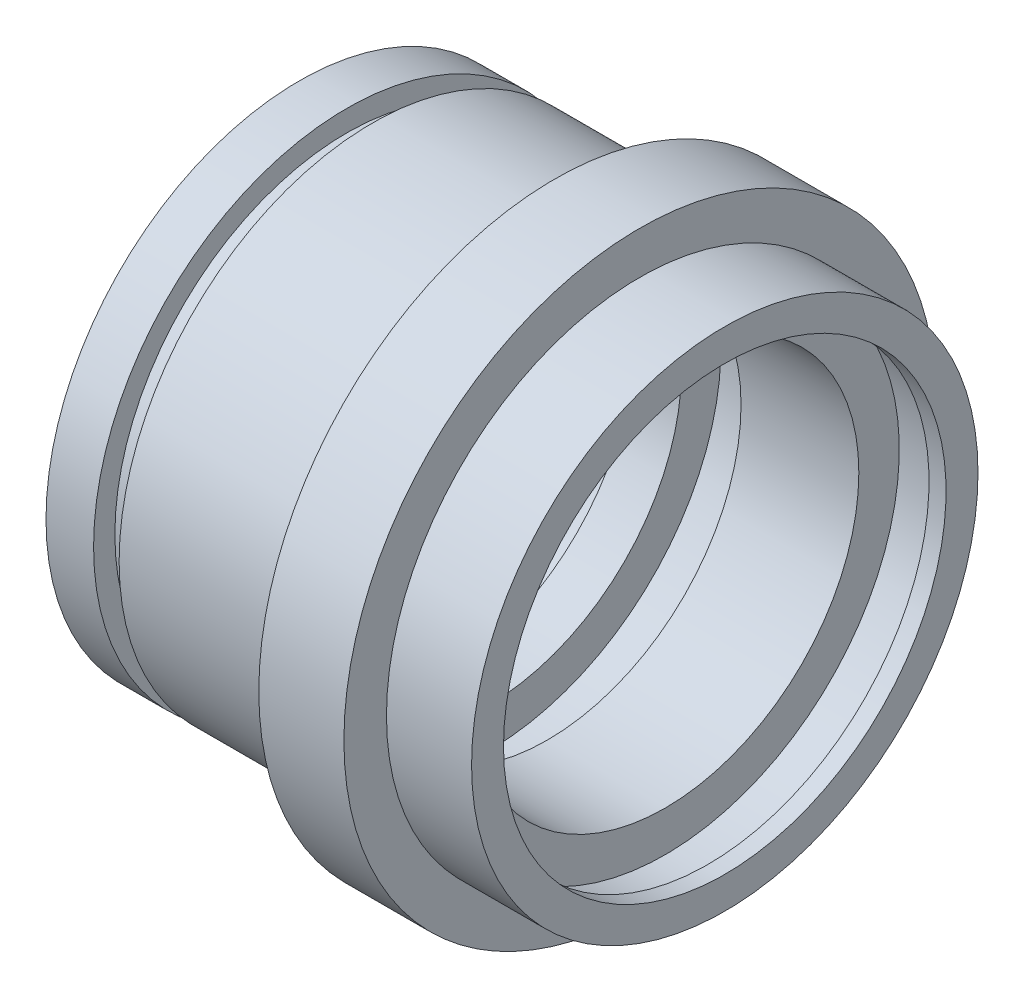
ISO-10303-21;
HEADER;
FILE_DESCRIPTION(('STEP AP214'),'2;1');
FILE_NAME('part.step','',(''),(''),'','','');
FILE_SCHEMA(('AUTOMOTIVE_DESIGN { 1 0 10303 214 1 1 1 1 }'));
ENDSEC;
DATA;
#1=APPLICATION_CONTEXT('core data for automotive mechanical design processes');
#2=APPLICATION_PROTOCOL_DEFINITION('international standard','automotive_design',2000,#1);
#3=PRODUCT_CONTEXT('',#1,'mechanical');
#4=PRODUCT('Part','Part','',(#3));
#5=PRODUCT_RELATED_PRODUCT_CATEGORY('part','',(#4));
#6=PRODUCT_DEFINITION_FORMATION('','',#4);
#7=PRODUCT_DEFINITION_CONTEXT('part definition',#1,'design');
#8=PRODUCT_DEFINITION('design','',#6,#7);
#9=PRODUCT_DEFINITION_SHAPE('','',#8);
#10=(LENGTH_UNIT() NAMED_UNIT(*) SI_UNIT(.MILLI.,.METRE.));
#11=(NAMED_UNIT(*) PLANE_ANGLE_UNIT() SI_UNIT($,.RADIAN.));
#12=(NAMED_UNIT(*) SI_UNIT($,.STERADIAN.) SOLID_ANGLE_UNIT());
#13=UNCERTAINTY_MEASURE_WITH_UNIT(LENGTH_MEASURE(1.E-05),#10,'distance_accuracy_value','');
#14=(GEOMETRIC_REPRESENTATION_CONTEXT(3) GLOBAL_UNCERTAINTY_ASSIGNED_CONTEXT((#13)) GLOBAL_UNIT_ASSIGNED_CONTEXT((#10,
#11,#12)) REPRESENTATION_CONTEXT('',''));
#15=CARTESIAN_POINT('',(0.,0.,0.));
#16=DIRECTION('',(0.,0.,1.));
#17=DIRECTION('',(1.,0.,0.));
#18=AXIS2_PLACEMENT_3D('',#15,#16,#17);
#19=CARTESIAN_POINT('',(-25.,22.75,0.));
#20=DIRECTION('',(1.,0.,0.));
#21=DIRECTION('',(0.,0.,-1.));
#22=AXIS2_PLACEMENT_3D('',#19,#20,#21);
#23=PLANE('',#22);
#24=CARTESIAN_POINT('',(-25.,0.,0.));
#25=DIRECTION('',(-1.,0.,0.));
#26=DIRECTION('',(0.,0.,1.));
#27=AXIS2_PLACEMENT_3D('',#24,#25,#26);
#28=CIRCLE('',#27,22.75);
#29=CARTESIAN_POINT('',(-25.,0.,22.75));
#30=VERTEX_POINT('',#29);
#31=EDGE_CURVE('E142',#30,#30,#28,.T.);
#32=ORIENTED_EDGE('',*,*,#31,.F.);
#33=EDGE_LOOP('',(#32));
#34=FACE_BOUND('',#33,.T.);
#35=CARTESIAN_POINT('',(-25.,0.,0.));
#36=DIRECTION('',(-1.,0.,0.));
#37=DIRECTION('',(0.,0.,1.));
#38=AXIS2_PLACEMENT_3D('',#35,#36,#37);
#39=CIRCLE('',#38,29.75);
#40=CARTESIAN_POINT('',(-25.,0.,29.75));
#41=VERTEX_POINT('',#40);
#42=EDGE_CURVE('E10',#41,#41,#39,.T.);
#43=ORIENTED_EDGE('',*,*,#42,.T.);
#44=EDGE_LOOP('',(#43));
#45=FACE_BOUND('',#44,.T.);
#46=ADVANCED_FACE('F43',(#34,#45),#23,.F.);
#47=CARTESIAN_POINT('',(-25.,0.,0.));
#48=DIRECTION('',(-1.,0.,0.));
#49=DIRECTION('',(0.,0.,1.));
#50=AXIS2_PLACEMENT_3D('',#47,#48,#49);
#51=CYLINDRICAL_SURFACE('',#50,29.75);
#52=ORIENTED_EDGE('',*,*,#42,.F.);
#53=EDGE_LOOP('',(#52));
#54=FACE_BOUND('',#53,.T.);
#55=CARTESIAN_POINT('',(-19.41,0.,0.));
#56=DIRECTION('',(-1.,0.,0.));
#57=DIRECTION('',(0.,0.,1.));
#58=AXIS2_PLACEMENT_3D('',#55,#56,#57);
#59=CIRCLE('',#58,29.75);
#60=CARTESIAN_POINT('',(-19.41,0.,29.75));
#61=VERTEX_POINT('',#60);
#62=EDGE_CURVE('E50',#61,#61,#59,.T.);
#63=ORIENTED_EDGE('',*,*,#62,.T.);
#64=EDGE_LOOP('',(#63));
#65=FACE_BOUND('',#64,.T.);
#66=ADVANCED_FACE('F150',(#54,#65),#51,.T.);
#67=CARTESIAN_POINT('',(-19.41,29.75,0.));
#68=DIRECTION('',(-1.,0.,0.));
#69=DIRECTION('',(0.,0.,1.));
#70=AXIS2_PLACEMENT_3D('',#67,#68,#69);
#71=PLANE('',#70);
#72=ORIENTED_EDGE('',*,*,#62,.F.);
#73=EDGE_LOOP('',(#72));
#74=FACE_BOUND('',#73,.T.);
#75=CARTESIAN_POINT('',(-19.41,0.,0.));
#76=DIRECTION('',(-1.,0.,0.));
#77=DIRECTION('',(0.,0.,1.));
#78=AXIS2_PLACEMENT_3D('',#75,#76,#77);
#79=CIRCLE('',#78,27.25);
#80=CARTESIAN_POINT('',(-19.41,0.,27.25));
#81=VERTEX_POINT('',#80);
#82=EDGE_CURVE('E55',#81,#81,#79,.T.);
#83=ORIENTED_EDGE('',*,*,#82,.T.);
#84=EDGE_LOOP('',(#83));
#85=FACE_BOUND('',#84,.T.);
#86=ADVANCED_FACE('F154',(#74,#85),#71,.F.);
#87=CARTESIAN_POINT('',(-25.,0.,0.));
#88=DIRECTION('',(-1.,0.,0.));
#89=DIRECTION('',(0.,0.,1.));
#90=AXIS2_PLACEMENT_3D('',#87,#88,#89);
#91=CYLINDRICAL_SURFACE('',#90,27.25);
#92=ORIENTED_EDGE('',*,*,#82,.F.);
#93=EDGE_LOOP('',(#92));
#94=FACE_BOUND('',#93,.T.);
#95=CARTESIAN_POINT('',(-16.41,0.,0.));
#96=DIRECTION('',(-1.,0.,0.));
#97=DIRECTION('',(0.,0.,1.));
#98=AXIS2_PLACEMENT_3D('',#95,#96,#97);
#99=CIRCLE('',#98,27.25);
#100=CARTESIAN_POINT('',(-16.41,0.,27.25));
#101=VERTEX_POINT('',#100);
#102=EDGE_CURVE('E60',#101,#101,#99,.T.);
#103=ORIENTED_EDGE('',*,*,#102,.T.);
#104=EDGE_LOOP('',(#103));
#105=FACE_BOUND('',#104,.T.);
#106=ADVANCED_FACE('F159',(#94,#105),#91,.T.);
#107=CARTESIAN_POINT('',(-16.41,27.25,0.));
#108=DIRECTION('',(1.,0.,0.));
#109=DIRECTION('',(0.,0.,-1.));
#110=AXIS2_PLACEMENT_3D('',#107,#108,#109);
#111=PLANE('',#110);
#112=ORIENTED_EDGE('',*,*,#102,.F.);
#113=EDGE_LOOP('',(#112));
#114=FACE_BOUND('',#113,.T.);
#115=CARTESIAN_POINT('',(-16.41,0.,0.));
#116=DIRECTION('',(-1.,0.,0.));
#117=DIRECTION('',(0.,0.,1.));
#118=AXIS2_PLACEMENT_3D('',#115,#116,#117);
#119=CIRCLE('',#118,29.75);
#120=CARTESIAN_POINT('',(-16.41,0.,29.75));
#121=VERTEX_POINT('',#120);
#122=EDGE_CURVE('E66',#121,#121,#119,.T.);
#123=ORIENTED_EDGE('',*,*,#122,.T.);
#124=EDGE_LOOP('',(#123));
#125=FACE_BOUND('',#124,.T.);
#126=ADVANCED_FACE('F165',(#114,#125),#111,.F.);
#127=CARTESIAN_POINT('',(-25.,0.,0.));
#128=DIRECTION('',(-1.,0.,0.));
#129=DIRECTION('',(0.,0.,1.));
#130=AXIS2_PLACEMENT_3D('',#127,#128,#129);
#131=CYLINDRICAL_SURFACE('',#130,29.75);
#132=ORIENTED_EDGE('',*,*,#122,.F.);
#133=EDGE_LOOP('',(#132));
#134=FACE_BOUND('',#133,.T.);
#135=CARTESIAN_POINT('',(4.99999999999999,0.,0.));
#136=DIRECTION('',(-1.,0.,0.));
#137=DIRECTION('',(0.,0.,1.));
#138=AXIS2_PLACEMENT_3D('',#135,#136,#137);
#139=CIRCLE('',#138,29.75);
#140=CARTESIAN_POINT('',(4.99999999999999,0.,29.75));
#141=VERTEX_POINT('',#140);
#142=EDGE_CURVE('E70',#141,#141,#139,.T.);
#143=ORIENTED_EDGE('',*,*,#142,.T.);
#144=EDGE_LOOP('',(#143));
#145=FACE_BOUND('',#144,.T.);
#146=ADVANCED_FACE('F169',(#134,#145),#131,.T.);
#147=CARTESIAN_POINT('',(4.99999999999999,29.75,0.));
#148=DIRECTION('',(1.,0.,0.));
#149=DIRECTION('',(0.,0.,-1.));
#150=AXIS2_PLACEMENT_3D('',#147,#148,#149);
#151=PLANE('',#150);
#152=ORIENTED_EDGE('',*,*,#142,.F.);
#153=EDGE_LOOP('',(#152));
#154=FACE_BOUND('',#153,.T.);
#155=CARTESIAN_POINT('',(4.99999999999999,0.,0.));
#156=DIRECTION('',(-1.,0.,0.));
#157=DIRECTION('',(0.,0.,1.));
#158=AXIS2_PLACEMENT_3D('',#155,#156,#157);
#159=CIRCLE('',#158,34.75);
#160=CARTESIAN_POINT('',(4.99999999999999,0.,34.75));
#161=VERTEX_POINT('',#160);
#162=EDGE_CURVE('E74',#161,#161,#159,.T.);
#163=ORIENTED_EDGE('',*,*,#162,.T.);
#164=EDGE_LOOP('',(#163));
#165=FACE_BOUND('',#164,.T.);
#166=ADVANCED_FACE('F173',(#154,#165),#151,.F.);
#167=CARTESIAN_POINT('',(-25.,0.,0.));
#168=DIRECTION('',(-1.,0.,0.));
#169=DIRECTION('',(0.,0.,1.));
#170=AXIS2_PLACEMENT_3D('',#167,#168,#169);
#171=CYLINDRICAL_SURFACE('',#170,34.75);
#172=ORIENTED_EDGE('',*,*,#162,.F.);
#173=EDGE_LOOP('',(#172));
#174=FACE_BOUND('',#173,.T.);
#175=CARTESIAN_POINT('',(15.,0.,0.));
#176=DIRECTION('',(-1.,0.,0.));
#177=DIRECTION('',(0.,0.,1.));
#178=AXIS2_PLACEMENT_3D('',#175,#176,#177);
#179=CIRCLE('',#178,34.75);
#180=CARTESIAN_POINT('',(15.,0.,34.75));
#181=VERTEX_POINT('',#180);
#182=EDGE_CURVE('E78',#181,#181,#179,.T.);
#183=ORIENTED_EDGE('',*,*,#182,.T.);
#184=EDGE_LOOP('',(#183));
#185=FACE_BOUND('',#184,.T.);
#186=ADVANCED_FACE('F177',(#174,#185),#171,.T.);
#187=CARTESIAN_POINT('',(15.,34.75,0.));
#188=DIRECTION('',(-1.,0.,0.));
#189=DIRECTION('',(0.,0.,1.));
#190=AXIS2_PLACEMENT_3D('',#187,#188,#189);
#191=PLANE('',#190);
#192=ORIENTED_EDGE('',*,*,#182,.F.);
#193=EDGE_LOOP('',(#192));
#194=FACE_BOUND('',#193,.T.);
#195=CARTESIAN_POINT('',(15.,0.,0.));
#196=DIRECTION('',(-1.,0.,0.));
#197=DIRECTION('',(0.,0.,1.));
#198=AXIS2_PLACEMENT_3D('',#195,#196,#197);
#199=CIRCLE('',#198,29.75);
#200=CARTESIAN_POINT('',(15.,0.,29.75));
#201=VERTEX_POINT('',#200);
#202=EDGE_CURVE('E82',#201,#201,#199,.T.);
#203=ORIENTED_EDGE('',*,*,#202,.T.);
#204=EDGE_LOOP('',(#203));
#205=FACE_BOUND('',#204,.T.);
#206=ADVANCED_FACE('F181',(#194,#205),#191,.F.);
#207=CARTESIAN_POINT('',(-25.,0.,0.));
#208=DIRECTION('',(-1.,0.,0.));
#209=DIRECTION('',(0.,0.,1.));
#210=AXIS2_PLACEMENT_3D('',#207,#208,#209);
#211=CYLINDRICAL_SURFACE('',#210,29.75);
#212=ORIENTED_EDGE('',*,*,#202,.F.);
#213=EDGE_LOOP('',(#212));
#214=FACE_BOUND('',#213,.T.);
#215=CARTESIAN_POINT('',(25.,0.,0.));
#216=DIRECTION('',(-1.,0.,0.));
#217=DIRECTION('',(0.,0.,1.));
#218=AXIS2_PLACEMENT_3D('',#215,#216,#217);
#219=CIRCLE('',#218,29.75);
#220=CARTESIAN_POINT('',(25.,0.,29.75));
#221=VERTEX_POINT('',#220);
#222=EDGE_CURVE('E86',#221,#221,#219,.T.);
#223=ORIENTED_EDGE('',*,*,#222,.T.);
#224=EDGE_LOOP('',(#223));
#225=FACE_BOUND('',#224,.T.);
#226=ADVANCED_FACE('F185',(#214,#225),#211,.T.);
#227=CARTESIAN_POINT('',(25.,29.75,0.));
#228=DIRECTION('',(-1.,0.,0.));
#229=DIRECTION('',(0.,0.,1.));
#230=AXIS2_PLACEMENT_3D('',#227,#228,#229);
#231=PLANE('',#230);
#232=ORIENTED_EDGE('',*,*,#222,.F.);
#233=EDGE_LOOP('',(#232));
#234=FACE_BOUND('',#233,.T.);
#235=CARTESIAN_POINT('',(25.,0.,0.));
#236=DIRECTION('',(-1.,0.,0.));
#237=DIRECTION('',(0.,0.,1.));
#238=AXIS2_PLACEMENT_3D('',#235,#236,#237);
#239=CIRCLE('',#238,26.);
#240=CARTESIAN_POINT('',(25.,0.,26.));
#241=VERTEX_POINT('',#240);
#242=EDGE_CURVE('E90',#241,#241,#239,.T.);
#243=ORIENTED_EDGE('',*,*,#242,.T.);
#244=EDGE_LOOP('',(#243));
#245=FACE_BOUND('',#244,.T.);
#246=ADVANCED_FACE('F189',(#234,#245),#231,.F.);
#247=CARTESIAN_POINT('',(-25.,0.,0.));
#248=DIRECTION('',(-1.,0.,0.));
#249=DIRECTION('',(0.,0.,1.));
#250=AXIS2_PLACEMENT_3D('',#247,#248,#249);
#251=CYLINDRICAL_SURFACE('',#250,26.);
#252=ORIENTED_EDGE('',*,*,#242,.F.);
#253=EDGE_LOOP('',(#252));
#254=FACE_BOUND('',#253,.T.);
#255=CARTESIAN_POINT('',(23.,0.,0.));
#256=DIRECTION('',(-1.,0.,0.));
#257=DIRECTION('',(0.,0.,1.));
#258=AXIS2_PLACEMENT_3D('',#255,#256,#257);
#259=CIRCLE('',#258,26.);
#260=CARTESIAN_POINT('',(23.,0.,26.));
#261=VERTEX_POINT('',#260);
#262=EDGE_CURVE('E94',#261,#261,#259,.T.);
#263=ORIENTED_EDGE('',*,*,#262,.T.);
#264=EDGE_LOOP('',(#263));
#265=FACE_BOUND('',#264,.T.);
#266=ADVANCED_FACE('F193',(#254,#265),#251,.F.);
#267=CARTESIAN_POINT('',(23.,27.5,0.));
#268=DIRECTION('',(1.,0.,0.));
#269=DIRECTION('',(0.,0.,-1.));
#270=AXIS2_PLACEMENT_3D('',#267,#268,#269);
#271=PLANE('',#270);
#272=ORIENTED_EDGE('',*,*,#262,.F.);
#273=EDGE_LOOP('',(#272));
#274=FACE_BOUND('',#273,.T.);
#275=CARTESIAN_POINT('',(23.,0.,0.));
#276=DIRECTION('',(-1.,0.,0.));
#277=DIRECTION('',(0.,0.,1.));
#278=AXIS2_PLACEMENT_3D('',#275,#276,#277);
#279=CIRCLE('',#278,27.5);
#280=CARTESIAN_POINT('',(23.,0.,27.5));
#281=VERTEX_POINT('',#280);
#282=EDGE_CURVE('E98',#281,#281,#279,.T.);
#283=ORIENTED_EDGE('',*,*,#282,.T.);
#284=EDGE_LOOP('',(#283));
#285=FACE_BOUND('',#284,.T.);
#286=ADVANCED_FACE('F197',(#274,#285),#271,.F.);
#287=CARTESIAN_POINT('',(-25.,0.,0.));
#288=DIRECTION('',(-1.,0.,0.));
#289=DIRECTION('',(0.,0.,1.));
#290=AXIS2_PLACEMENT_3D('',#287,#288,#289);
#291=CYLINDRICAL_SURFACE('',#290,27.5);
#292=ORIENTED_EDGE('',*,*,#282,.F.);
#293=EDGE_LOOP('',(#292));
#294=FACE_BOUND('',#293,.T.);
#295=CARTESIAN_POINT('',(18.,0.,0.));
#296=DIRECTION('',(-1.,0.,0.));
#297=DIRECTION('',(0.,0.,1.));
#298=AXIS2_PLACEMENT_3D('',#295,#296,#297);
#299=CIRCLE('',#298,27.5);
#300=CARTESIAN_POINT('',(18.,0.,27.5));
#301=VERTEX_POINT('',#300);
#302=EDGE_CURVE('E102',#301,#301,#299,.T.);
#303=ORIENTED_EDGE('',*,*,#302,.T.);
#304=EDGE_LOOP('',(#303));
#305=FACE_BOUND('',#304,.T.);
#306=ADVANCED_FACE('F201',(#294,#305),#291,.F.);
#307=CARTESIAN_POINT('',(18.,22.75,0.));
#308=DIRECTION('',(-1.,0.,0.));
#309=DIRECTION('',(0.,0.,1.));
#310=AXIS2_PLACEMENT_3D('',#307,#308,#309);
#311=PLANE('',#310);
#312=ORIENTED_EDGE('',*,*,#302,.F.);
#313=EDGE_LOOP('',(#312));
#314=FACE_BOUND('',#313,.T.);
#315=CARTESIAN_POINT('',(18.,0.,0.));
#316=DIRECTION('',(-1.,0.,0.));
#317=DIRECTION('',(0.,0.,1.));
#318=AXIS2_PLACEMENT_3D('',#315,#316,#317);
#319=CIRCLE('',#318,22.75);
#320=CARTESIAN_POINT('',(18.,0.,22.75));
#321=VERTEX_POINT('',#320);
#322=EDGE_CURVE('E106',#321,#321,#319,.T.);
#323=ORIENTED_EDGE('',*,*,#322,.T.);
#324=EDGE_LOOP('',(#323));
#325=FACE_BOUND('',#324,.T.);
#326=ADVANCED_FACE('F205',(#314,#325),#311,.F.);
#327=CARTESIAN_POINT('',(-25.,0.,0.));
#328=DIRECTION('',(-1.,0.,0.));
#329=DIRECTION('',(0.,0.,1.));
#330=AXIS2_PLACEMENT_3D('',#327,#328,#329);
#331=CYLINDRICAL_SURFACE('',#330,22.75);
#332=ORIENTED_EDGE('',*,*,#322,.F.);
#333=EDGE_LOOP('',(#332));
#334=FACE_BOUND('',#333,.T.);
#335=CARTESIAN_POINT('',(4.16,0.,0.));
#336=DIRECTION('',(-1.,0.,0.));
#337=DIRECTION('',(0.,0.,1.));
#338=AXIS2_PLACEMENT_3D('',#335,#336,#337);
#339=CIRCLE('',#338,22.75);
#340=CARTESIAN_POINT('',(4.16,0.,22.75));
#341=VERTEX_POINT('',#340);
#342=EDGE_CURVE('E110',#341,#341,#339,.T.);
#343=ORIENTED_EDGE('',*,*,#342,.T.);
#344=EDGE_LOOP('',(#343));
#345=FACE_BOUND('',#344,.T.);
#346=ADVANCED_FACE('F209',(#334,#345),#331,.F.);
#347=CARTESIAN_POINT('',(4.16,27.39,0.));
#348=DIRECTION('',(1.,0.,0.));
#349=DIRECTION('',(0.,0.,-1.));
#350=AXIS2_PLACEMENT_3D('',#347,#348,#349);
#351=PLANE('',#350);
#352=ORIENTED_EDGE('',*,*,#342,.F.);
#353=EDGE_LOOP('',(#352));
#354=FACE_BOUND('',#353,.T.);
#355=CARTESIAN_POINT('',(4.16,0.,0.));
#356=DIRECTION('',(-1.,0.,0.));
#357=DIRECTION('',(0.,0.,1.));
#358=AXIS2_PLACEMENT_3D('',#355,#356,#357);
#359=CIRCLE('',#358,27.39);
#360=CARTESIAN_POINT('',(4.16,0.,27.39));
#361=VERTEX_POINT('',#360);
#362=EDGE_CURVE('E114',#361,#361,#359,.T.);
#363=ORIENTED_EDGE('',*,*,#362,.T.);
#364=EDGE_LOOP('',(#363));
#365=FACE_BOUND('',#364,.T.);
#366=ADVANCED_FACE('F213',(#354,#365),#351,.F.);
#367=CARTESIAN_POINT('',(-25.,0.,0.));
#368=DIRECTION('',(-1.,0.,0.));
#369=DIRECTION('',(0.,0.,1.));
#370=AXIS2_PLACEMENT_3D('',#367,#368,#369);
#371=CYLINDRICAL_SURFACE('',#370,27.39);
#372=ORIENTED_EDGE('',*,*,#362,.F.);
#373=EDGE_LOOP('',(#372));
#374=FACE_BOUND('',#373,.T.);
#375=CARTESIAN_POINT('',(-2.84,0.,0.));
#376=DIRECTION('',(-1.,0.,0.));
#377=DIRECTION('',(0.,0.,1.));
#378=AXIS2_PLACEMENT_3D('',#375,#376,#377);
#379=CIRCLE('',#378,27.39);
#380=CARTESIAN_POINT('',(-2.84,0.,27.39));
#381=VERTEX_POINT('',#380);
#382=EDGE_CURVE('E118',#381,#381,#379,.T.);
#383=ORIENTED_EDGE('',*,*,#382,.T.);
#384=EDGE_LOOP('',(#383));
#385=FACE_BOUND('',#384,.T.);
#386=ADVANCED_FACE('F217',(#374,#385),#371,.F.);
#387=CARTESIAN_POINT('',(-2.84,22.75,0.));
#388=DIRECTION('',(-1.,0.,0.));
#389=DIRECTION('',(0.,0.,1.));
#390=AXIS2_PLACEMENT_3D('',#387,#388,#389);
#391=PLANE('',#390);
#392=ORIENTED_EDGE('',*,*,#382,.F.);
#393=EDGE_LOOP('',(#392));
#394=FACE_BOUND('',#393,.T.);
#395=CARTESIAN_POINT('',(-2.84,0.,0.));
#396=DIRECTION('',(-1.,0.,0.));
#397=DIRECTION('',(0.,0.,1.));
#398=AXIS2_PLACEMENT_3D('',#395,#396,#397);
#399=CIRCLE('',#398,22.75);
#400=CARTESIAN_POINT('',(-2.84,0.,22.75));
#401=VERTEX_POINT('',#400);
#402=EDGE_CURVE('E122',#401,#401,#399,.T.);
#403=ORIENTED_EDGE('',*,*,#402,.T.);
#404=EDGE_LOOP('',(#403));
#405=FACE_BOUND('',#404,.T.);
#406=ADVANCED_FACE('F221',(#394,#405),#391,.F.);
#407=CARTESIAN_POINT('',(-25.,0.,0.));
#408=DIRECTION('',(-1.,0.,0.));
#409=DIRECTION('',(0.,0.,1.));
#410=AXIS2_PLACEMENT_3D('',#407,#408,#409);
#411=CYLINDRICAL_SURFACE('',#410,22.75);
#412=ORIENTED_EDGE('',*,*,#402,.F.);
#413=EDGE_LOOP('',(#412));
#414=FACE_BOUND('',#413,.T.);
#415=CARTESIAN_POINT('',(-8.49,0.,0.));
#416=DIRECTION('',(-1.,0.,0.));
#417=DIRECTION('',(0.,0.,1.));
#418=AXIS2_PLACEMENT_3D('',#415,#416,#417);
#419=CIRCLE('',#418,22.75);
#420=CARTESIAN_POINT('',(-8.49,0.,22.75));
#421=VERTEX_POINT('',#420);
#422=EDGE_CURVE('E126',#421,#421,#419,.T.);
#423=ORIENTED_EDGE('',*,*,#422,.T.);
#424=EDGE_LOOP('',(#423));
#425=FACE_BOUND('',#424,.T.);
#426=ADVANCED_FACE('F225',(#414,#425),#411,.F.);
#427=CARTESIAN_POINT('',(-8.49,24.,0.));
#428=DIRECTION('',(1.,0.,0.));
#429=DIRECTION('',(0.,0.,-1.));
#430=AXIS2_PLACEMENT_3D('',#427,#428,#429);
#431=PLANE('',#430);
#432=ORIENTED_EDGE('',*,*,#422,.F.);
#433=EDGE_LOOP('',(#432));
#434=FACE_BOUND('',#433,.T.);
#435=CARTESIAN_POINT('',(-8.49,0.,0.));
#436=DIRECTION('',(-1.,0.,0.));
#437=DIRECTION('',(0.,0.,1.));
#438=AXIS2_PLACEMENT_3D('',#435,#436,#437);
#439=CIRCLE('',#438,24.);
#440=CARTESIAN_POINT('',(-8.49,0.,24.));
#441=VERTEX_POINT('',#440);
#442=EDGE_CURVE('E130',#441,#441,#439,.T.);
#443=ORIENTED_EDGE('',*,*,#442,.T.);
#444=EDGE_LOOP('',(#443));
#445=FACE_BOUND('',#444,.T.);
#446=ADVANCED_FACE('F229',(#434,#445),#431,.F.);
#447=CARTESIAN_POINT('',(-25.,0.,0.));
#448=DIRECTION('',(-1.,0.,0.));
#449=DIRECTION('',(0.,0.,1.));
#450=AXIS2_PLACEMENT_3D('',#447,#448,#449);
#451=CYLINDRICAL_SURFACE('',#450,24.);
#452=ORIENTED_EDGE('',*,*,#442,.F.);
#453=EDGE_LOOP('',(#452));
#454=FACE_BOUND('',#453,.T.);
#455=CARTESIAN_POINT('',(-15.49,0.,0.));
#456=DIRECTION('',(-1.,0.,0.));
#457=DIRECTION('',(0.,0.,1.));
#458=AXIS2_PLACEMENT_3D('',#455,#456,#457);
#459=CIRCLE('',#458,24.);
#460=CARTESIAN_POINT('',(-15.49,0.,24.));
#461=VERTEX_POINT('',#460);
#462=EDGE_CURVE('E134',#461,#461,#459,.T.);
#463=ORIENTED_EDGE('',*,*,#462,.T.);
#464=EDGE_LOOP('',(#463));
#465=FACE_BOUND('',#464,.T.);
#466=ADVANCED_FACE('F233',(#454,#465),#451,.F.);
#467=CARTESIAN_POINT('',(-15.49,22.75,0.));
#468=DIRECTION('',(-1.,0.,0.));
#469=DIRECTION('',(0.,0.,1.));
#470=AXIS2_PLACEMENT_3D('',#467,#468,#469);
#471=PLANE('',#470);
#472=ORIENTED_EDGE('',*,*,#462,.F.);
#473=EDGE_LOOP('',(#472));
#474=FACE_BOUND('',#473,.T.);
#475=CARTESIAN_POINT('',(-15.49,0.,0.));
#476=DIRECTION('',(-1.,0.,0.));
#477=DIRECTION('',(0.,0.,1.));
#478=AXIS2_PLACEMENT_3D('',#475,#476,#477);
#479=CIRCLE('',#478,22.75);
#480=CARTESIAN_POINT('',(-15.49,0.,22.75));
#481=VERTEX_POINT('',#480);
#482=EDGE_CURVE('E138',#481,#481,#479,.T.);
#483=ORIENTED_EDGE('',*,*,#482,.T.);
#484=EDGE_LOOP('',(#483));
#485=FACE_BOUND('',#484,.T.);
#486=ADVANCED_FACE('F237',(#474,#485),#471,.F.);
#487=CARTESIAN_POINT('',(-25.,0.,0.));
#488=DIRECTION('',(-1.,0.,0.));
#489=DIRECTION('',(0.,0.,1.));
#490=AXIS2_PLACEMENT_3D('',#487,#488,#489);
#491=CYLINDRICAL_SURFACE('',#490,22.75);
#492=ORIENTED_EDGE('',*,*,#482,.F.);
#493=EDGE_LOOP('',(#492));
#494=FACE_BOUND('',#493,.T.);
#495=ORIENTED_EDGE('',*,*,#31,.T.);
#496=EDGE_LOOP('',(#495));
#497=FACE_BOUND('',#496,.T.);
#498=ADVANCED_FACE('F147',(#494,#497),#491,.F.);
#499=CLOSED_SHELL('',(#46,#66,#86,#106,#126,#146,#166,#186,#206,#226,#246,#266,#286,#306,#326,
#346,#366,#386,#406,#426,#446,#466,#486,#498));
#500=MANIFOLD_SOLID_BREP('B2',#499);
#501=ADVANCED_BREP_SHAPE_REPRESENTATION('',(#18,#500),#14);
#502=SHAPE_DEFINITION_REPRESENTATION(#9,#501);
ENDSEC;
END-ISO-10303-21;
